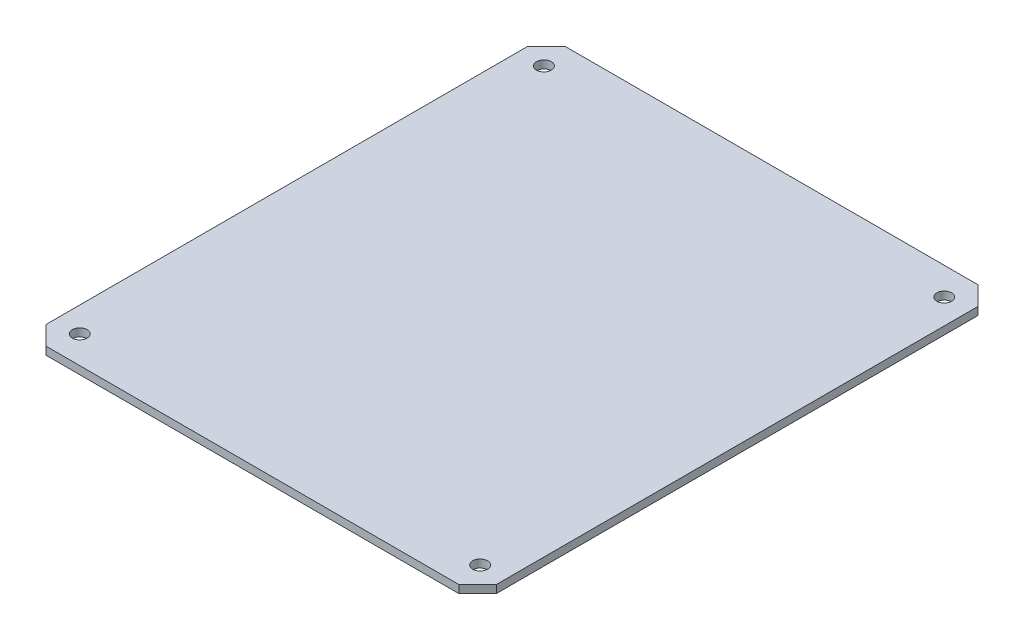
ISO-10303-21;
HEADER;
FILE_DESCRIPTION(('STEP AP214'),'2;1');
FILE_NAME('part.step','',(''),(''),'','','');
FILE_SCHEMA(('AUTOMOTIVE_DESIGN { 1 0 10303 214 1 1 1 1 }'));
ENDSEC;
DATA;
#1=APPLICATION_CONTEXT('core data for automotive mechanical design processes');
#2=APPLICATION_PROTOCOL_DEFINITION('international standard','automotive_design',2000,#1);
#3=PRODUCT_CONTEXT('',#1,'mechanical');
#4=PRODUCT('Part','Part','',(#3));
#5=PRODUCT_RELATED_PRODUCT_CATEGORY('part','',(#4));
#6=PRODUCT_DEFINITION_FORMATION('','',#4);
#7=PRODUCT_DEFINITION_CONTEXT('part definition',#1,'design');
#8=PRODUCT_DEFINITION('design','',#6,#7);
#9=PRODUCT_DEFINITION_SHAPE('','',#8);
#10=(LENGTH_UNIT() NAMED_UNIT(*) SI_UNIT(.MILLI.,.METRE.));
#11=(NAMED_UNIT(*) PLANE_ANGLE_UNIT() SI_UNIT($,.RADIAN.));
#12=(NAMED_UNIT(*) SI_UNIT($,.STERADIAN.) SOLID_ANGLE_UNIT());
#13=UNCERTAINTY_MEASURE_WITH_UNIT(LENGTH_MEASURE(1.E-05),#10,'distance_accuracy_value','');
#14=(GEOMETRIC_REPRESENTATION_CONTEXT(3) GLOBAL_UNCERTAINTY_ASSIGNED_CONTEXT((#13)) GLOBAL_UNIT_ASSIGNED_CONTEXT((#10,
#11,#12)) REPRESENTATION_CONTEXT('',''));
#15=CARTESIAN_POINT('',(0.,0.,0.));
#16=DIRECTION('',(0.,0.,1.));
#17=DIRECTION('',(1.,0.,0.));
#18=AXIS2_PLACEMENT_3D('',#15,#16,#17);
#19=CARTESIAN_POINT('',(0.,1.6,0.));
#20=DIRECTION('',(0.,1.,0.));
#21=DIRECTION('',(0.,0.,1.));
#22=AXIS2_PLACEMENT_3D('',#19,#20,#21);
#23=PLANE('',#22);
#24=CARTESIAN_POINT('',(40.64,1.6,47.117));
#25=DIRECTION('',(0.,1.,0.));
#26=DIRECTION('',(0.,0.,1.));
#27=AXIS2_PLACEMENT_3D('',#24,#25,#26);
#28=CIRCLE('',#27,1.5);
#29=CARTESIAN_POINT('',(40.64,1.6,48.617));
#30=VERTEX_POINT('',#29);
#31=EDGE_CURVE('E190',#30,#30,#28,.T.);
#32=ORIENTED_EDGE('',*,*,#31,.F.);
#33=EDGE_LOOP('',(#32));
#34=FACE_BOUND('',#33,.T.);
#35=CARTESIAN_POINT('',(-40.64,1.6,-47.117));
#36=DIRECTION('',(0.,1.,0.));
#37=DIRECTION('',(0.,0.,1.));
#38=AXIS2_PLACEMENT_3D('',#35,#36,#37);
#39=CIRCLE('',#38,1.5);
#40=CARTESIAN_POINT('',(-40.64,1.6,-45.617));
#41=VERTEX_POINT('',#40);
#42=EDGE_CURVE('E136',#41,#41,#39,.T.);
#43=ORIENTED_EDGE('',*,*,#42,.F.);
#44=EDGE_LOOP('',(#43));
#45=FACE_BOUND('',#44,.T.);
#46=DIRECTION('',(0.,0.,1.));
#47=VECTOR('',#46,1.);
#48=CARTESIAN_POINT('',(-45.72,1.6,-48.895));
#49=LINE('',#48,#47);
#50=CARTESIAN_POINT('',(-45.72,1.6,-48.895));
#51=VERTEX_POINT('',#50);
#52=CARTESIAN_POINT('',(-45.72,1.6,48.895));
#53=VERTEX_POINT('',#52);
#54=EDGE_CURVE('E147',#51,#53,#49,.T.);
#55=ORIENTED_EDGE('',*,*,#54,.T.);
#56=DIRECTION('',(0.707106781186547,0.,0.707106781186548));
#57=VECTOR('',#56,1.);
#58=CARTESIAN_POINT('',(-45.72,1.6,48.895));
#59=LINE('',#58,#57);
#60=CARTESIAN_POINT('',(-41.91,1.6,52.705));
#61=VERTEX_POINT('',#60);
#62=EDGE_CURVE('E95',#53,#61,#59,.T.);
#63=ORIENTED_EDGE('',*,*,#62,.T.);
#64=DIRECTION('',(1.,0.,0.));
#65=VECTOR('',#64,1.);
#66=CARTESIAN_POINT('',(-41.91,1.6,52.705));
#67=LINE('',#66,#65);
#68=CARTESIAN_POINT('',(41.91,1.6,52.705));
#69=VERTEX_POINT('',#68);
#70=EDGE_CURVE('E162',#61,#69,#67,.T.);
#71=ORIENTED_EDGE('',*,*,#70,.T.);
#72=DIRECTION('',(0.707106781186547,0.,-0.707106781186548));
#73=VECTOR('',#72,1.);
#74=CARTESIAN_POINT('',(45.72,1.6,48.895));
#75=LINE('',#74,#73);
#76=CARTESIAN_POINT('',(45.72,1.6,48.895));
#77=VERTEX_POINT('',#76);
#78=EDGE_CURVE('E175',#69,#77,#75,.T.);
#79=ORIENTED_EDGE('',*,*,#78,.T.);
#80=DIRECTION('',(0.,0.,-1.));
#81=VECTOR('',#80,1.);
#82=CARTESIAN_POINT('',(45.72,1.6,-48.895));
#83=LINE('',#82,#81);
#84=CARTESIAN_POINT('',(45.72,1.6,-48.895));
#85=VERTEX_POINT('',#84);
#86=EDGE_CURVE('E114',#77,#85,#83,.T.);
#87=ORIENTED_EDGE('',*,*,#86,.T.);
#88=DIRECTION('',(-0.707106781186547,0.,-0.707106781186548));
#89=VECTOR('',#88,1.);
#90=CARTESIAN_POINT('',(41.91,1.6,-52.705));
#91=LINE('',#90,#89);
#92=CARTESIAN_POINT('',(41.91,1.6,-52.705));
#93=VERTEX_POINT('',#92);
#94=EDGE_CURVE('E108',#85,#93,#91,.T.);
#95=ORIENTED_EDGE('',*,*,#94,.T.);
#96=DIRECTION('',(-1.,0.,0.));
#97=VECTOR('',#96,1.);
#98=CARTESIAN_POINT('',(-41.91,1.6,-52.705));
#99=LINE('',#98,#97);
#100=CARTESIAN_POINT('',(-41.91,1.6,-52.705));
#101=VERTEX_POINT('',#100);
#102=EDGE_CURVE('E112',#93,#101,#99,.T.);
#103=ORIENTED_EDGE('',*,*,#102,.T.);
#104=DIRECTION('',(-0.707106781186547,0.,0.707106781186547));
#105=VECTOR('',#104,1.);
#106=CARTESIAN_POINT('',(-41.91,1.6,-52.705));
#107=LINE('',#106,#105);
#108=EDGE_CURVE('E52',#101,#51,#107,.T.);
#109=ORIENTED_EDGE('',*,*,#108,.T.);
#110=EDGE_LOOP('',(#55,#63,#71,#79,#87,#95,#103,#109));
#111=FACE_BOUND('',#110,.T.);
#112=CARTESIAN_POINT('',(40.64,1.6,-47.117));
#113=DIRECTION('',(0.,1.,0.));
#114=DIRECTION('',(0.,0.,1.));
#115=AXIS2_PLACEMENT_3D('',#112,#113,#114);
#116=CIRCLE('',#115,1.5);
#117=CARTESIAN_POINT('',(40.64,1.6,-45.617));
#118=VERTEX_POINT('',#117);
#119=EDGE_CURVE('E184',#118,#118,#116,.T.);
#120=ORIENTED_EDGE('',*,*,#119,.F.);
#121=EDGE_LOOP('',(#120));
#122=FACE_BOUND('',#121,.T.);
#123=CARTESIAN_POINT('',(-40.64,1.6,47.117));
#124=DIRECTION('',(0.,1.,0.));
#125=DIRECTION('',(0.,0.,1.));
#126=AXIS2_PLACEMENT_3D('',#123,#124,#125);
#127=CIRCLE('',#126,1.5);
#128=CARTESIAN_POINT('',(-40.64,1.6,48.617));
#129=VERTEX_POINT('',#128);
#130=EDGE_CURVE('E196',#129,#129,#127,.T.);
#131=ORIENTED_EDGE('',*,*,#130,.F.);
#132=EDGE_LOOP('',(#131));
#133=FACE_BOUND('',#132,.T.);
#134=ADVANCED_FACE('F35',(#34,#45,#111,#122,#133),#23,.T.);
#135=CARTESIAN_POINT('',(0.,0.,0.));
#136=DIRECTION('',(0.,1.,0.));
#137=DIRECTION('',(0.,0.,1.));
#138=AXIS2_PLACEMENT_3D('',#135,#136,#137);
#139=PLANE('',#138);
#140=DIRECTION('',(0.,0.,1.));
#141=VECTOR('',#140,1.);
#142=CARTESIAN_POINT('',(-45.72,0.,-48.895));
#143=LINE('',#142,#141);
#144=CARTESIAN_POINT('',(-45.72,0.,-48.895));
#145=VERTEX_POINT('',#144);
#146=CARTESIAN_POINT('',(-45.72,0.,48.895));
#147=VERTEX_POINT('',#146);
#148=EDGE_CURVE('E132',#145,#147,#143,.T.);
#149=ORIENTED_EDGE('',*,*,#148,.F.);
#150=DIRECTION('',(-0.707106781186547,0.,0.707106781186547));
#151=VECTOR('',#150,1.);
#152=CARTESIAN_POINT('',(-41.91,0.,-52.705));
#153=LINE('',#152,#151);
#154=CARTESIAN_POINT('',(-41.91,0.,-52.705));
#155=VERTEX_POINT('',#154);
#156=EDGE_CURVE('E87',#155,#145,#153,.T.);
#157=ORIENTED_EDGE('',*,*,#156,.F.);
#158=DIRECTION('',(-1.,0.,0.));
#159=VECTOR('',#158,1.);
#160=CARTESIAN_POINT('',(-41.91,0.,-52.705));
#161=LINE('',#160,#159);
#162=CARTESIAN_POINT('',(41.91,0.,-52.705));
#163=VERTEX_POINT('',#162);
#164=EDGE_CURVE('E81',#163,#155,#161,.T.);
#165=ORIENTED_EDGE('',*,*,#164,.F.);
#166=DIRECTION('',(-0.707106781186547,0.,-0.707106781186548));
#167=VECTOR('',#166,1.);
#168=CARTESIAN_POINT('',(41.91,0.,-52.705));
#169=LINE('',#168,#167);
#170=CARTESIAN_POINT('',(45.72,0.,-48.895));
#171=VERTEX_POINT('',#170);
#172=EDGE_CURVE('E122',#171,#163,#169,.T.);
#173=ORIENTED_EDGE('',*,*,#172,.F.);
#174=DIRECTION('',(0.,0.,-1.));
#175=VECTOR('',#174,1.);
#176=CARTESIAN_POINT('',(45.72,0.,-48.895));
#177=LINE('',#176,#175);
#178=CARTESIAN_POINT('',(45.72,0.,48.895));
#179=VERTEX_POINT('',#178);
#180=EDGE_CURVE('E142',#179,#171,#177,.T.);
#181=ORIENTED_EDGE('',*,*,#180,.F.);
#182=DIRECTION('',(0.707106781186547,0.,-0.707106781186548));
#183=VECTOR('',#182,1.);
#184=CARTESIAN_POINT('',(45.72,0.,48.895));
#185=LINE('',#184,#183);
#186=CARTESIAN_POINT('',(41.91,0.,52.705));
#187=VERTEX_POINT('',#186);
#188=EDGE_CURVE('E140',#187,#179,#185,.T.);
#189=ORIENTED_EDGE('',*,*,#188,.F.);
#190=DIRECTION('',(1.,0.,0.));
#191=VECTOR('',#190,1.);
#192=CARTESIAN_POINT('',(-41.91,0.,52.705));
#193=LINE('',#192,#191);
#194=CARTESIAN_POINT('',(-41.91,0.,52.705));
#195=VERTEX_POINT('',#194);
#196=EDGE_CURVE('E138',#195,#187,#193,.T.);
#197=ORIENTED_EDGE('',*,*,#196,.F.);
#198=DIRECTION('',(0.707106781186547,0.,0.707106781186548));
#199=VECTOR('',#198,1.);
#200=CARTESIAN_POINT('',(-45.72,0.,48.895));
#201=LINE('',#200,#199);
#202=EDGE_CURVE('E135',#147,#195,#201,.T.);
#203=ORIENTED_EDGE('',*,*,#202,.F.);
#204=EDGE_LOOP('',(#149,#157,#165,#173,#181,#189,#197,#203));
#205=FACE_BOUND('',#204,.T.);
#206=CARTESIAN_POINT('',(-40.64,0.,-47.117));
#207=DIRECTION('',(0.,1.,0.));
#208=DIRECTION('',(0.,0.,1.));
#209=AXIS2_PLACEMENT_3D('',#206,#207,#208);
#210=CIRCLE('',#209,1.5);
#211=CARTESIAN_POINT('',(-40.64,0.,-45.617));
#212=VERTEX_POINT('',#211);
#213=EDGE_CURVE('E181',#212,#212,#210,.T.);
#214=ORIENTED_EDGE('',*,*,#213,.T.);
#215=EDGE_LOOP('',(#214));
#216=FACE_BOUND('',#215,.T.);
#217=CARTESIAN_POINT('',(40.64,0.,-47.117));
#218=DIRECTION('',(0.,1.,0.));
#219=DIRECTION('',(0.,0.,1.));
#220=AXIS2_PLACEMENT_3D('',#217,#218,#219);
#221=CIRCLE('',#220,1.5);
#222=CARTESIAN_POINT('',(40.64,0.,-45.617));
#223=VERTEX_POINT('',#222);
#224=EDGE_CURVE('E187',#223,#223,#221,.T.);
#225=ORIENTED_EDGE('',*,*,#224,.T.);
#226=EDGE_LOOP('',(#225));
#227=FACE_BOUND('',#226,.T.);
#228=CARTESIAN_POINT('',(40.64,0.,47.117));
#229=DIRECTION('',(0.,1.,0.));
#230=DIRECTION('',(0.,0.,1.));
#231=AXIS2_PLACEMENT_3D('',#228,#229,#230);
#232=CIRCLE('',#231,1.5);
#233=CARTESIAN_POINT('',(40.64,0.,48.617));
#234=VERTEX_POINT('',#233);
#235=EDGE_CURVE('E193',#234,#234,#232,.T.);
#236=ORIENTED_EDGE('',*,*,#235,.T.);
#237=EDGE_LOOP('',(#236));
#238=FACE_BOUND('',#237,.T.);
#239=CARTESIAN_POINT('',(-40.64,0.,47.117));
#240=DIRECTION('',(0.,1.,0.));
#241=DIRECTION('',(0.,0.,1.));
#242=AXIS2_PLACEMENT_3D('',#239,#240,#241);
#243=CIRCLE('',#242,1.5);
#244=CARTESIAN_POINT('',(-40.64,0.,48.617));
#245=VERTEX_POINT('',#244);
#246=EDGE_CURVE('E199',#245,#245,#243,.T.);
#247=ORIENTED_EDGE('',*,*,#246,.T.);
#248=EDGE_LOOP('',(#247));
#249=FACE_BOUND('',#248,.T.);
#250=ADVANCED_FACE('F166',(#205,#216,#227,#238,#249),#139,.F.);
#251=CARTESIAN_POINT('',(-45.72,1.6,-48.895));
#252=DIRECTION('',(1.,0.,0.));
#253=DIRECTION('',(0.,0.,-1.));
#254=AXIS2_PLACEMENT_3D('',#251,#252,#253);
#255=PLANE('',#254);
#256=ORIENTED_EDGE('',*,*,#148,.T.);
#257=DIRECTION('',(0.,-1.,0.));
#258=VECTOR('',#257,1.);
#259=CARTESIAN_POINT('',(-45.72,1.6,48.895));
#260=LINE('',#259,#258);
#261=EDGE_CURVE('E11',#53,#147,#260,.T.);
#262=ORIENTED_EDGE('',*,*,#261,.F.);
#263=ORIENTED_EDGE('',*,*,#54,.F.);
#264=DIRECTION('',(0.,-1.,0.));
#265=VECTOR('',#264,1.);
#266=CARTESIAN_POINT('',(-45.72,1.6,-48.895));
#267=LINE('',#266,#265);
#268=EDGE_CURVE('E128',#51,#145,#267,.T.);
#269=ORIENTED_EDGE('',*,*,#268,.T.);
#270=EDGE_LOOP('',(#256,#262,#263,#269));
#271=FACE_BOUND('',#270,.T.);
#272=ADVANCED_FACE('F37',(#271),#255,.F.);
#273=CARTESIAN_POINT('',(-45.72,1.6,48.895));
#274=DIRECTION('',(0.707106781186548,0.,-0.707106781186547));
#275=DIRECTION('',(-0.707106781186547,0.,-0.707106781186548));
#276=AXIS2_PLACEMENT_3D('',#273,#274,#275);
#277=PLANE('',#276);
#278=ORIENTED_EDGE('',*,*,#202,.T.);
#279=DIRECTION('',(0.,-1.,0.));
#280=VECTOR('',#279,1.);
#281=CARTESIAN_POINT('',(-41.91,1.6,52.705));
#282=LINE('',#281,#280);
#283=EDGE_CURVE('E44',#61,#195,#282,.T.);
#284=ORIENTED_EDGE('',*,*,#283,.F.);
#285=ORIENTED_EDGE('',*,*,#62,.F.);
#286=ORIENTED_EDGE('',*,*,#261,.T.);
#287=EDGE_LOOP('',(#278,#284,#285,#286));
#288=FACE_BOUND('',#287,.T.);
#289=ADVANCED_FACE('F233',(#288),#277,.F.);
#290=CARTESIAN_POINT('',(-41.91,1.6,52.705));
#291=DIRECTION('',(0.,0.,-1.));
#292=DIRECTION('',(-1.,0.,0.));
#293=AXIS2_PLACEMENT_3D('',#290,#291,#292);
#294=PLANE('',#293);
#295=ORIENTED_EDGE('',*,*,#196,.T.);
#296=DIRECTION('',(0.,-1.,0.));
#297=VECTOR('',#296,1.);
#298=CARTESIAN_POINT('',(41.91,1.6,52.705));
#299=LINE('',#298,#297);
#300=EDGE_CURVE('E154',#69,#187,#299,.T.);
#301=ORIENTED_EDGE('',*,*,#300,.F.);
#302=ORIENTED_EDGE('',*,*,#70,.F.);
#303=ORIENTED_EDGE('',*,*,#283,.T.);
#304=EDGE_LOOP('',(#295,#301,#302,#303));
#305=FACE_BOUND('',#304,.T.);
#306=ADVANCED_FACE('F160',(#305),#294,.F.);
#307=CARTESIAN_POINT('',(45.72,1.6,48.895));
#308=DIRECTION('',(-0.707106781186548,0.,-0.707106781186547));
#309=DIRECTION('',(-0.707106781186547,0.,0.707106781186548));
#310=AXIS2_PLACEMENT_3D('',#307,#308,#309);
#311=PLANE('',#310);
#312=ORIENTED_EDGE('',*,*,#188,.T.);
#313=DIRECTION('',(0.,-1.,0.));
#314=VECTOR('',#313,1.);
#315=CARTESIAN_POINT('',(45.72,1.6,48.895));
#316=LINE('',#315,#314);
#317=EDGE_CURVE('E151',#77,#179,#316,.T.);
#318=ORIENTED_EDGE('',*,*,#317,.F.);
#319=ORIENTED_EDGE('',*,*,#78,.F.);
#320=ORIENTED_EDGE('',*,*,#300,.T.);
#321=EDGE_LOOP('',(#312,#318,#319,#320));
#322=FACE_BOUND('',#321,.T.);
#323=ADVANCED_FACE('F171',(#322),#311,.F.);
#324=CARTESIAN_POINT('',(45.72,1.6,-48.895));
#325=DIRECTION('',(-1.,0.,0.));
#326=DIRECTION('',(0.,0.,1.));
#327=AXIS2_PLACEMENT_3D('',#324,#325,#326);
#328=PLANE('',#327);
#329=ORIENTED_EDGE('',*,*,#180,.T.);
#330=DIRECTION('',(0.,-1.,0.));
#331=VECTOR('',#330,1.);
#332=CARTESIAN_POINT('',(45.72,1.6,-48.895));
#333=LINE('',#332,#331);
#334=EDGE_CURVE('E123',#85,#171,#333,.T.);
#335=ORIENTED_EDGE('',*,*,#334,.F.);
#336=ORIENTED_EDGE('',*,*,#86,.F.);
#337=ORIENTED_EDGE('',*,*,#317,.T.);
#338=EDGE_LOOP('',(#329,#335,#336,#337));
#339=FACE_BOUND('',#338,.T.);
#340=ADVANCED_FACE('F174',(#339),#328,.F.);
#341=CARTESIAN_POINT('',(41.91,1.6,-52.705));
#342=DIRECTION('',(-0.707106781186548,0.,0.707106781186547));
#343=DIRECTION('',(0.707106781186547,0.,0.707106781186548));
#344=AXIS2_PLACEMENT_3D('',#341,#342,#343);
#345=PLANE('',#344);
#346=ORIENTED_EDGE('',*,*,#172,.T.);
#347=DIRECTION('',(0.,-1.,0.));
#348=VECTOR('',#347,1.);
#349=CARTESIAN_POINT('',(41.91,1.6,-52.705));
#350=LINE('',#349,#348);
#351=EDGE_CURVE('E119',#93,#163,#350,.T.);
#352=ORIENTED_EDGE('',*,*,#351,.F.);
#353=ORIENTED_EDGE('',*,*,#94,.F.);
#354=ORIENTED_EDGE('',*,*,#334,.T.);
#355=EDGE_LOOP('',(#346,#352,#353,#354));
#356=FACE_BOUND('',#355,.T.);
#357=ADVANCED_FACE('F120',(#356),#345,.F.);
#358=CARTESIAN_POINT('',(-41.91,1.6,-52.705));
#359=DIRECTION('',(0.,0.,1.));
#360=DIRECTION('',(1.,0.,0.));
#361=AXIS2_PLACEMENT_3D('',#358,#359,#360);
#362=PLANE('',#361);
#363=ORIENTED_EDGE('',*,*,#164,.T.);
#364=DIRECTION('',(0.,-1.,0.));
#365=VECTOR('',#364,1.);
#366=CARTESIAN_POINT('',(-41.91,1.6,-52.705));
#367=LINE('',#366,#365);
#368=EDGE_CURVE('E124',#101,#155,#367,.T.);
#369=ORIENTED_EDGE('',*,*,#368,.F.);
#370=ORIENTED_EDGE('',*,*,#102,.F.);
#371=ORIENTED_EDGE('',*,*,#351,.T.);
#372=EDGE_LOOP('',(#363,#369,#370,#371));
#373=FACE_BOUND('',#372,.T.);
#374=ADVANCED_FACE('F126',(#373),#362,.F.);
#375=CARTESIAN_POINT('',(-41.91,1.6,-52.705));
#376=DIRECTION('',(0.707106781186548,0.,0.707106781186548));
#377=DIRECTION('',(0.707106781186548,0.,-0.707106781186548));
#378=AXIS2_PLACEMENT_3D('',#375,#376,#377);
#379=PLANE('',#378);
#380=ORIENTED_EDGE('',*,*,#156,.T.);
#381=ORIENTED_EDGE('',*,*,#268,.F.);
#382=ORIENTED_EDGE('',*,*,#108,.F.);
#383=ORIENTED_EDGE('',*,*,#368,.T.);
#384=EDGE_LOOP('',(#380,#381,#382,#383));
#385=FACE_BOUND('',#384,.T.);
#386=ADVANCED_FACE('F221',(#385),#379,.F.);
#387=CARTESIAN_POINT('',(-40.64,1.6,-47.117));
#388=DIRECTION('',(0.,-1.,0.));
#389=DIRECTION('',(0.,0.,-1.));
#390=AXIS2_PLACEMENT_3D('',#387,#388,#389);
#391=CYLINDRICAL_SURFACE('',#390,1.5);
#392=ORIENTED_EDGE('',*,*,#42,.T.);
#393=EDGE_LOOP('',(#392));
#394=FACE_BOUND('',#393,.T.);
#395=ORIENTED_EDGE('',*,*,#213,.F.);
#396=EDGE_LOOP('',(#395));
#397=FACE_BOUND('',#396,.T.);
#398=ADVANCED_FACE('F218',(#394,#397),#391,.F.);
#399=CARTESIAN_POINT('',(40.64,1.6,-47.117));
#400=DIRECTION('',(0.,-1.,0.));
#401=DIRECTION('',(0.,0.,-1.));
#402=AXIS2_PLACEMENT_3D('',#399,#400,#401);
#403=CYLINDRICAL_SURFACE('',#402,1.5);
#404=ORIENTED_EDGE('',*,*,#119,.T.);
#405=EDGE_LOOP('',(#404));
#406=FACE_BOUND('',#405,.T.);
#407=ORIENTED_EDGE('',*,*,#224,.F.);
#408=EDGE_LOOP('',(#407));
#409=FACE_BOUND('',#408,.T.);
#410=ADVANCED_FACE('F297',(#406,#409),#403,.F.);
#411=CARTESIAN_POINT('',(40.64,1.6,47.117));
#412=DIRECTION('',(0.,-1.,0.));
#413=DIRECTION('',(0.,0.,-1.));
#414=AXIS2_PLACEMENT_3D('',#411,#412,#413);
#415=CYLINDRICAL_SURFACE('',#414,1.5);
#416=ORIENTED_EDGE('',*,*,#31,.T.);
#417=EDGE_LOOP('',(#416));
#418=FACE_BOUND('',#417,.T.);
#419=ORIENTED_EDGE('',*,*,#235,.F.);
#420=EDGE_LOOP('',(#419));
#421=FACE_BOUND('',#420,.T.);
#422=ADVANCED_FACE('F305',(#418,#421),#415,.F.);
#423=CARTESIAN_POINT('',(-40.64,1.6,47.117));
#424=DIRECTION('',(0.,-1.,0.));
#425=DIRECTION('',(0.,0.,-1.));
#426=AXIS2_PLACEMENT_3D('',#423,#424,#425);
#427=CYLINDRICAL_SURFACE('',#426,1.5);
#428=ORIENTED_EDGE('',*,*,#130,.T.);
#429=EDGE_LOOP('',(#428));
#430=FACE_BOUND('',#429,.T.);
#431=ORIENTED_EDGE('',*,*,#246,.F.);
#432=EDGE_LOOP('',(#431));
#433=FACE_BOUND('',#432,.T.);
#434=ADVANCED_FACE('F205',(#430,#433),#427,.F.);
#435=CLOSED_SHELL('',(#134,#250,#272,#289,#306,#323,#340,#357,#374,#386,#398,#410,#422,#434));
#436=MANIFOLD_SOLID_BREP('B2',#435);
#437=ADVANCED_BREP_SHAPE_REPRESENTATION('',(#18,#436),#14);
#438=SHAPE_DEFINITION_REPRESENTATION(#9,#437);
ENDSEC;
END-ISO-10303-21;
